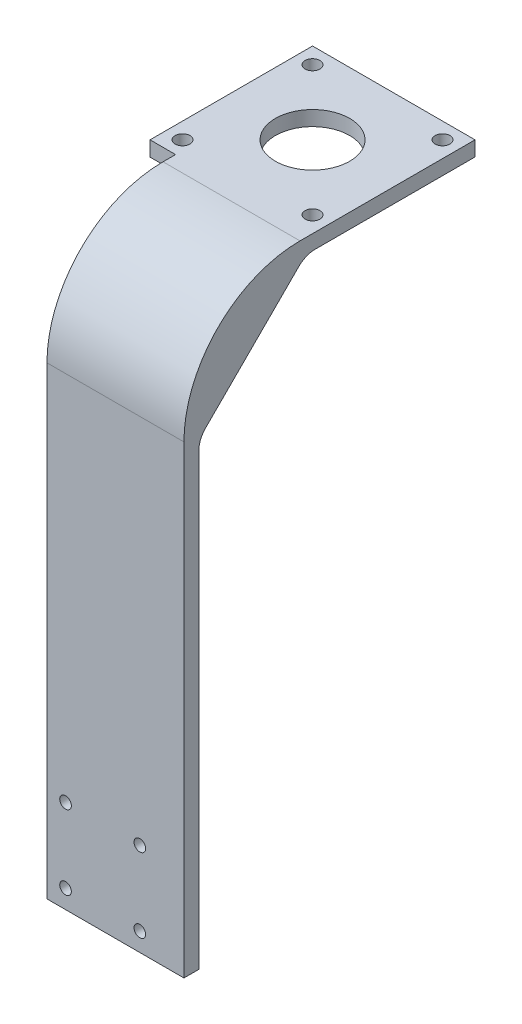
ISO-10303-21;
HEADER;
FILE_DESCRIPTION(('STEP AP214'),'2;1');
FILE_NAME('part.step','',(''),(''),'','','');
FILE_SCHEMA(('AUTOMOTIVE_DESIGN { 1 0 10303 214 1 1 1 1 }'));
ENDSEC;
DATA;
#1=APPLICATION_CONTEXT('core data for automotive mechanical design processes');
#2=APPLICATION_PROTOCOL_DEFINITION('international standard','automotive_design',2000,#1);
#3=PRODUCT_CONTEXT('',#1,'mechanical');
#4=PRODUCT('Part','Part','',(#3));
#5=PRODUCT_RELATED_PRODUCT_CATEGORY('part','',(#4));
#6=PRODUCT_DEFINITION_FORMATION('','',#4);
#7=PRODUCT_DEFINITION_CONTEXT('part definition',#1,'design');
#8=PRODUCT_DEFINITION('design','',#6,#7);
#9=PRODUCT_DEFINITION_SHAPE('','',#8);
#10=(LENGTH_UNIT() NAMED_UNIT(*) SI_UNIT(.MILLI.,.METRE.));
#11=(NAMED_UNIT(*) PLANE_ANGLE_UNIT() SI_UNIT($,.RADIAN.));
#12=(NAMED_UNIT(*) SI_UNIT($,.STERADIAN.) SOLID_ANGLE_UNIT());
#13=UNCERTAINTY_MEASURE_WITH_UNIT(LENGTH_MEASURE(1.E-05),#10,'distance_accuracy_value','');
#14=(GEOMETRIC_REPRESENTATION_CONTEXT(3) GLOBAL_UNCERTAINTY_ASSIGNED_CONTEXT((#13)) GLOBAL_UNIT_ASSIGNED_CONTEXT((#10,
#11,#12)) REPRESENTATION_CONTEXT('',''));
#15=CARTESIAN_POINT('',(0.,0.,0.));
#16=DIRECTION('',(0.,0.,1.));
#17=DIRECTION('',(1.,0.,0.));
#18=AXIS2_PLACEMENT_3D('',#15,#16,#17);
#19=CARTESIAN_POINT('',(0.,0.,3.2));
#20=DIRECTION('',(0.,0.,-1.));
#21=DIRECTION('',(-1.,0.,0.));
#22=AXIS2_PLACEMENT_3D('',#19,#20,#21);
#23=PLANE('',#22);
#24=DIRECTION('',(1.,0.,0.));
#25=VECTOR('',#24,1.);
#26=CARTESIAN_POINT('',(-12.,-12.,3.2));
#27=LINE('',#26,#25);
#28=CARTESIAN_POINT('',(-12.,-12.,3.2));
#29=VERTEX_POINT('',#28);
#30=CARTESIAN_POINT('',(17.5,-12.,3.2));
#31=VERTEX_POINT('',#30);
#32=EDGE_CURVE('E244',#29,#31,#27,.T.);
#33=ORIENTED_EDGE('',*,*,#32,.T.);
#34=DIRECTION('',(0.,-1.,0.));
#35=VECTOR('',#34,1.);
#36=CARTESIAN_POINT('',(17.5,88.,3.2));
#37=LINE('',#36,#35);
#38=CARTESIAN_POINT('',(17.5,88.,3.19999999999999));
#39=VERTEX_POINT('',#38);
#40=EDGE_CURVE('E161',#39,#31,#37,.T.);
#41=ORIENTED_EDGE('',*,*,#40,.F.);
#42=DIRECTION('',(-1.,0.,0.));
#43=VECTOR('',#42,1.);
#44=CARTESIAN_POINT('',(0.,88.,3.2));
#45=LINE('',#44,#43);
#46=CARTESIAN_POINT('',(-12.,88.,3.2));
#47=VERTEX_POINT('',#46);
#48=EDGE_CURVE('E255',#39,#47,#45,.T.);
#49=ORIENTED_EDGE('',*,*,#48,.T.);
#50=DIRECTION('',(0.,-1.,0.));
#51=VECTOR('',#50,1.);
#52=CARTESIAN_POINT('',(-12.,-12.,3.2));
#53=LINE('',#52,#51);
#54=EDGE_CURVE('E242',#47,#29,#53,.T.);
#55=ORIENTED_EDGE('',*,*,#54,.T.);
#56=EDGE_LOOP('',(#33,#41,#49,#55));
#57=FACE_BOUND('',#56,.T.);
#58=CARTESIAN_POINT('',(-8.,8.,3.2));
#59=DIRECTION('',(0.,0.,1.));
#60=DIRECTION('',(1.,0.,0.));
#61=AXIS2_PLACEMENT_3D('',#58,#59,#60);
#62=CIRCLE('',#61,1.25);
#63=CARTESIAN_POINT('',(-6.75,8.,3.2));
#64=VERTEX_POINT('',#63);
#65=EDGE_CURVE('E236',#64,#64,#62,.T.);
#66=ORIENTED_EDGE('',*,*,#65,.F.);
#67=EDGE_LOOP('',(#66));
#68=FACE_BOUND('',#67,.T.);
#69=CARTESIAN_POINT('',(8.,8.,3.2));
#70=DIRECTION('',(0.,0.,1.));
#71=DIRECTION('',(1.,0.,0.));
#72=AXIS2_PLACEMENT_3D('',#69,#70,#71);
#73=CIRCLE('',#72,1.25);
#74=CARTESIAN_POINT('',(9.25,8.,3.2));
#75=VERTEX_POINT('',#74);
#76=EDGE_CURVE('E230',#75,#75,#73,.T.);
#77=ORIENTED_EDGE('',*,*,#76,.F.);
#78=EDGE_LOOP('',(#77));
#79=FACE_BOUND('',#78,.T.);
#80=CARTESIAN_POINT('',(8.,-8.,3.2));
#81=DIRECTION('',(0.,0.,1.));
#82=DIRECTION('',(1.,0.,0.));
#83=AXIS2_PLACEMENT_3D('',#80,#81,#82);
#84=CIRCLE('',#83,1.25);
#85=CARTESIAN_POINT('',(9.25,-8.,3.2));
#86=VERTEX_POINT('',#85);
#87=EDGE_CURVE('E224',#86,#86,#84,.T.);
#88=ORIENTED_EDGE('',*,*,#87,.F.);
#89=EDGE_LOOP('',(#88));
#90=FACE_BOUND('',#89,.T.);
#91=CARTESIAN_POINT('',(-8.,-8.,3.2));
#92=DIRECTION('',(0.,0.,1.));
#93=DIRECTION('',(1.,0.,0.));
#94=AXIS2_PLACEMENT_3D('',#91,#92,#93);
#95=CIRCLE('',#94,1.25);
#96=CARTESIAN_POINT('',(-6.75,-8.,3.2));
#97=VERTEX_POINT('',#96);
#98=EDGE_CURVE('E218',#97,#97,#95,.T.);
#99=ORIENTED_EDGE('',*,*,#98,.F.);
#100=EDGE_LOOP('',(#99));
#101=FACE_BOUND('',#100,.T.);
#102=ADVANCED_FACE('F35',(#57,#68,#79,#90,#101),#23,.F.);
#103=CARTESIAN_POINT('',(0.,0.,0.));
#104=DIRECTION('',(0.,0.,-1.));
#105=DIRECTION('',(-1.,0.,0.));
#106=AXIS2_PLACEMENT_3D('',#103,#104,#105);
#107=PLANE('',#106);
#108=DIRECTION('',(0.,-1.,0.));
#109=VECTOR('',#108,1.);
#110=CARTESIAN_POINT('',(-12.,-12.,0.));
#111=LINE('',#110,#109);
#112=CARTESIAN_POINT('',(-12.,84.7289321881346,0.));
#113=VERTEX_POINT('',#112);
#114=CARTESIAN_POINT('',(-12.,-12.,0.));
#115=VERTEX_POINT('',#114);
#116=EDGE_CURVE('E239',#113,#115,#111,.T.);
#117=ORIENTED_EDGE('',*,*,#116,.F.);
#118=DIRECTION('',(1.,0.,0.));
#119=VECTOR('',#118,1.);
#120=CARTESIAN_POINT('',(0.,84.7289321881346,0.));
#121=LINE('',#120,#119);
#122=CARTESIAN_POINT('',(17.5,84.7289321881346,0.));
#123=VERTEX_POINT('',#122);
#124=EDGE_CURVE('E142',#113,#123,#121,.T.);
#125=ORIENTED_EDGE('',*,*,#124,.T.);
#126=DIRECTION('',(0.,1.,0.));
#127=VECTOR('',#126,1.);
#128=CARTESIAN_POINT('',(17.5,-12.,0.));
#129=LINE('',#128,#127);
#130=CARTESIAN_POINT('',(17.5,-12.,0.));
#131=VERTEX_POINT('',#130);
#132=EDGE_CURVE('E154',#131,#123,#129,.T.);
#133=ORIENTED_EDGE('',*,*,#132,.F.);
#134=DIRECTION('',(1.,0.,0.));
#135=VECTOR('',#134,1.);
#136=CARTESIAN_POINT('',(-12.,-12.,0.));
#137=LINE('',#136,#135);
#138=EDGE_CURVE('E245',#115,#131,#137,.T.);
#139=ORIENTED_EDGE('',*,*,#138,.F.);
#140=EDGE_LOOP('',(#117,#125,#133,#139));
#141=FACE_BOUND('',#140,.T.);
#142=CARTESIAN_POINT('',(8.,-8.,0.));
#143=DIRECTION('',(0.,0.,1.));
#144=DIRECTION('',(1.,0.,0.));
#145=AXIS2_PLACEMENT_3D('',#142,#143,#144);
#146=CIRCLE('',#145,1.25);
#147=CARTESIAN_POINT('',(9.25,-8.,0.));
#148=VERTEX_POINT('',#147);
#149=EDGE_CURVE('E221',#148,#148,#146,.T.);
#150=ORIENTED_EDGE('',*,*,#149,.T.);
#151=EDGE_LOOP('',(#150));
#152=FACE_BOUND('',#151,.T.);
#153=CARTESIAN_POINT('',(-8.,8.,0.));
#154=DIRECTION('',(0.,0.,1.));
#155=DIRECTION('',(1.,0.,0.));
#156=AXIS2_PLACEMENT_3D('',#153,#154,#155);
#157=CIRCLE('',#156,1.25);
#158=CARTESIAN_POINT('',(-6.75,8.,0.));
#159=VERTEX_POINT('',#158);
#160=EDGE_CURVE('E233',#159,#159,#157,.T.);
#161=ORIENTED_EDGE('',*,*,#160,.T.);
#162=EDGE_LOOP('',(#161));
#163=FACE_BOUND('',#162,.T.);
#164=CARTESIAN_POINT('',(8.,8.,0.));
#165=DIRECTION('',(0.,0.,1.));
#166=DIRECTION('',(1.,0.,0.));
#167=AXIS2_PLACEMENT_3D('',#164,#165,#166);
#168=CIRCLE('',#167,1.25);
#169=CARTESIAN_POINT('',(9.25,8.,0.));
#170=VERTEX_POINT('',#169);
#171=EDGE_CURVE('E227',#170,#170,#168,.T.);
#172=ORIENTED_EDGE('',*,*,#171,.T.);
#173=EDGE_LOOP('',(#172));
#174=FACE_BOUND('',#173,.T.);
#175=CARTESIAN_POINT('',(-8.,-8.,0.));
#176=DIRECTION('',(0.,0.,1.));
#177=DIRECTION('',(1.,0.,0.));
#178=AXIS2_PLACEMENT_3D('',#175,#176,#177);
#179=CIRCLE('',#178,1.25);
#180=CARTESIAN_POINT('',(-6.75,-8.,0.));
#181=VERTEX_POINT('',#180);
#182=EDGE_CURVE('E217',#181,#181,#179,.T.);
#183=ORIENTED_EDGE('',*,*,#182,.T.);
#184=EDGE_LOOP('',(#183));
#185=FACE_BOUND('',#184,.T.);
#186=ADVANCED_FACE('F308',(#141,#152,#163,#174,#185),#107,.T.);
#187=CARTESIAN_POINT('',(-12.,-12.,3.2));
#188=DIRECTION('',(1.,0.,0.));
#189=DIRECTION('',(0.,0.,-1.));
#190=AXIS2_PLACEMENT_3D('',#187,#188,#189);
#191=PLANE('',#190);
#192=ORIENTED_EDGE('',*,*,#54,.F.);
#193=CARTESIAN_POINT('',(-12.,88.,-21.8));
#194=DIRECTION('',(1.,0.,0.));
#195=DIRECTION('',(0.,0.,-1.));
#196=AXIS2_PLACEMENT_3D('',#193,#194,#195);
#197=CIRCLE('',#196,25.);
#198=CARTESIAN_POINT('',(-12.,113.,-21.8));
#199=VERTEX_POINT('',#198);
#200=EDGE_CURVE('E258',#47,#199,#197,.F.);
#201=ORIENTED_EDGE('',*,*,#200,.T.);
#202=DIRECTION('',(0.,0.,-1.));
#203=VECTOR('',#202,1.);
#204=CARTESIAN_POINT('',(-12.,113.,3.2));
#205=LINE('',#204,#203);
#206=CARTESIAN_POINT('',(-12.,113.,-24.5));
#207=VERTEX_POINT('',#206);
#208=EDGE_CURVE('E247',#199,#207,#205,.T.);
#209=ORIENTED_EDGE('',*,*,#208,.T.);
#210=DIRECTION('',(0.,-1.,0.));
#211=VECTOR('',#210,1.);
#212=CARTESIAN_POINT('',(-12.,-12.,-24.5));
#213=LINE('',#212,#211);
#214=CARTESIAN_POINT('',(-12.,109.767281102802,-24.5));
#215=VERTEX_POINT('',#214);
#216=EDGE_CURVE('E50',#207,#215,#213,.T.);
#217=ORIENTED_EDGE('',*,*,#216,.T.);
#218=CARTESIAN_POINT('',(-12.,104.8,-25.0710678118656));
#219=DIRECTION('',(1.,0.,0.));
#220=DIRECTION('',(0.,0.,-1.));
#221=AXIS2_PLACEMENT_3D('',#218,#219,#220);
#222=CIRCLE('',#221,5.);
#223=CARTESIAN_POINT('',(-12.,108.335533905933,-21.5355339059329));
#224=VERTEX_POINT('',#223);
#225=EDGE_CURVE('E133',#215,#224,#222,.T.);
#226=ORIENTED_EDGE('',*,*,#225,.T.);
#227=DIRECTION('',(0.,-0.707106781186544,0.707106781186551));
#228=VECTOR('',#227,1.);
#229=CARTESIAN_POINT('',(-12.,35.8000000000006,51.0000000000001));
#230=LINE('',#229,#228);
#231=CARTESIAN_POINT('',(-12.,88.2644660940674,-1.46446609406729));
#232=VERTEX_POINT('',#231);
#233=EDGE_CURVE('E141',#224,#232,#230,.T.);
#234=ORIENTED_EDGE('',*,*,#233,.T.);
#235=CARTESIAN_POINT('',(-12.,84.7289321881346,-5.));
#236=DIRECTION('',(1.,0.,0.));
#237=DIRECTION('',(0.,0.,-1.));
#238=AXIS2_PLACEMENT_3D('',#235,#236,#237);
#239=CIRCLE('',#238,5.);
#240=EDGE_CURVE('E11',#232,#113,#239,.T.);
#241=ORIENTED_EDGE('',*,*,#240,.T.);
#242=ORIENTED_EDGE('',*,*,#116,.T.);
#243=DIRECTION('',(0.,0.,-1.));
#244=VECTOR('',#243,1.);
#245=CARTESIAN_POINT('',(-12.,-12.,3.2));
#246=LINE('',#245,#244);
#247=EDGE_CURVE('E251',#29,#115,#246,.T.);
#248=ORIENTED_EDGE('',*,*,#247,.F.);
#249=EDGE_LOOP('',(#192,#201,#209,#217,#226,#234,#241,#242,#248));
#250=FACE_BOUND('',#249,.T.);
#251=ADVANCED_FACE('F271',(#250),#191,.F.);
#252=CARTESIAN_POINT('',(-12.,-12.,3.2));
#253=DIRECTION('',(0.,1.,0.));
#254=DIRECTION('',(0.,0.,1.));
#255=AXIS2_PLACEMENT_3D('',#252,#253,#254);
#256=PLANE('',#255);
#257=ORIENTED_EDGE('',*,*,#138,.T.);
#258=DIRECTION('',(0.,0.,-1.));
#259=VECTOR('',#258,1.);
#260=CARTESIAN_POINT('',(17.5,-12.,3.20000000000001));
#261=LINE('',#260,#259);
#262=EDGE_CURVE('E158',#31,#131,#261,.T.);
#263=ORIENTED_EDGE('',*,*,#262,.F.);
#264=ORIENTED_EDGE('',*,*,#32,.F.);
#265=ORIENTED_EDGE('',*,*,#247,.T.);
#266=EDGE_LOOP('',(#257,#263,#264,#265));
#267=FACE_BOUND('',#266,.T.);
#268=ADVANCED_FACE('F303',(#267),#256,.F.);
#269=CARTESIAN_POINT('',(-12.,113.,3.2));
#270=DIRECTION('',(0.,-1.,0.));
#271=DIRECTION('',(0.,0.,-1.));
#272=AXIS2_PLACEMENT_3D('',#269,#270,#271);
#273=PLANE('',#272);
#274=CARTESIAN_POINT('',(0.,113.,-42.));
#275=DIRECTION('',(0.,-1.,0.));
#276=DIRECTION('',(0.,0.,-1.));
#277=AXIS2_PLACEMENT_3D('',#274,#275,#276);
#278=CIRCLE('',#277,8.);
#279=CARTESIAN_POINT('',(0.,113.,-50.));
#280=VERTEX_POINT('',#279);
#281=EDGE_CURVE('E152',#280,#280,#278,.F.);
#282=ORIENTED_EDGE('',*,*,#281,.F.);
#283=EDGE_LOOP('',(#282));
#284=FACE_BOUND('',#283,.T.);
#285=ORIENTED_EDGE('',*,*,#208,.F.);
#286=DIRECTION('',(-1.,0.,0.));
#287=VECTOR('',#286,1.);
#288=CARTESIAN_POINT('',(-12.,113.,-21.8));
#289=LINE('',#288,#287);
#290=CARTESIAN_POINT('',(17.5,113.,-21.8));
#291=VERTEX_POINT('',#290);
#292=EDGE_CURVE('E260',#199,#291,#289,.F.);
#293=ORIENTED_EDGE('',*,*,#292,.T.);
#294=DIRECTION('',(0.,0.,-1.));
#295=VECTOR('',#294,1.);
#296=CARTESIAN_POINT('',(17.5,113.,-59.5));
#297=LINE('',#296,#295);
#298=CARTESIAN_POINT('',(17.5,113.,-59.5));
#299=VERTEX_POINT('',#298);
#300=EDGE_CURVE('E204',#291,#299,#297,.T.);
#301=ORIENTED_EDGE('',*,*,#300,.T.);
#302=DIRECTION('',(-1.,0.,0.));
#303=VECTOR('',#302,1.);
#304=CARTESIAN_POINT('',(17.5,113.,-59.5));
#305=LINE('',#304,#303);
#306=CARTESIAN_POINT('',(-17.5,113.,-59.5));
#307=VERTEX_POINT('',#306);
#308=EDGE_CURVE('E207',#299,#307,#305,.T.);
#309=ORIENTED_EDGE('',*,*,#308,.T.);
#310=DIRECTION('',(0.,0.,1.));
#311=VECTOR('',#310,1.);
#312=CARTESIAN_POINT('',(-17.5,113.,-59.5));
#313=LINE('',#312,#311);
#314=CARTESIAN_POINT('',(-17.5,113.,-24.5));
#315=VERTEX_POINT('',#314);
#316=EDGE_CURVE('E198',#307,#315,#313,.T.);
#317=ORIENTED_EDGE('',*,*,#316,.T.);
#318=DIRECTION('',(1.,0.,0.));
#319=VECTOR('',#318,1.);
#320=CARTESIAN_POINT('',(17.5,113.,-24.5));
#321=LINE('',#320,#319);
#322=EDGE_CURVE('E201',#315,#207,#321,.T.);
#323=ORIENTED_EDGE('',*,*,#322,.T.);
#324=EDGE_LOOP('',(#285,#293,#301,#309,#317,#323));
#325=FACE_BOUND('',#324,.T.);
#326=CARTESIAN_POINT('',(-14.,113.,-28.));
#327=DIRECTION('',(0.,1.,0.));
#328=DIRECTION('',(0.,0.,1.));
#329=AXIS2_PLACEMENT_3D('',#326,#327,#328);
#330=CIRCLE('',#329,1.6);
#331=CARTESIAN_POINT('',(-14.,113.,-26.4));
#332=VERTEX_POINT('',#331);
#333=EDGE_CURVE('E169',#332,#332,#330,.T.);
#334=ORIENTED_EDGE('',*,*,#333,.F.);
#335=EDGE_LOOP('',(#334));
#336=FACE_BOUND('',#335,.T.);
#337=CARTESIAN_POINT('',(-14.,113.,-56.));
#338=DIRECTION('',(0.,1.,0.));
#339=DIRECTION('',(0.,0.,1.));
#340=AXIS2_PLACEMENT_3D('',#337,#338,#339);
#341=CIRCLE('',#340,1.6);
#342=CARTESIAN_POINT('',(-14.,113.,-54.4));
#343=VERTEX_POINT('',#342);
#344=EDGE_CURVE('E189',#343,#343,#341,.T.);
#345=ORIENTED_EDGE('',*,*,#344,.F.);
#346=EDGE_LOOP('',(#345));
#347=FACE_BOUND('',#346,.T.);
#348=CARTESIAN_POINT('',(14.,113.,-56.));
#349=DIRECTION('',(0.,1.,0.));
#350=DIRECTION('',(0.,0.,1.));
#351=AXIS2_PLACEMENT_3D('',#348,#349,#350);
#352=CIRCLE('',#351,1.6);
#353=CARTESIAN_POINT('',(14.,113.,-54.4));
#354=VERTEX_POINT('',#353);
#355=EDGE_CURVE('E192',#354,#354,#352,.T.);
#356=ORIENTED_EDGE('',*,*,#355,.F.);
#357=EDGE_LOOP('',(#356));
#358=FACE_BOUND('',#357,.T.);
#359=CARTESIAN_POINT('',(14.,113.,-28.));
#360=DIRECTION('',(0.,1.,0.));
#361=DIRECTION('',(0.,0.,1.));
#362=AXIS2_PLACEMENT_3D('',#359,#360,#361);
#363=CIRCLE('',#362,1.6);
#364=CARTESIAN_POINT('',(14.,113.,-26.4));
#365=VERTEX_POINT('',#364);
#366=EDGE_CURVE('E195',#365,#365,#363,.T.);
#367=ORIENTED_EDGE('',*,*,#366,.F.);
#368=EDGE_LOOP('',(#367));
#369=FACE_BOUND('',#368,.T.);
#370=ADVANCED_FACE('F277',(#284,#325,#336,#347,#358,#369),#273,.F.);
#371=CARTESIAN_POINT('',(-8.,8.,3.2));
#372=DIRECTION('',(0.,0.,-1.));
#373=DIRECTION('',(-1.,0.,0.));
#374=AXIS2_PLACEMENT_3D('',#371,#372,#373);
#375=CYLINDRICAL_SURFACE('',#374,1.25);
#376=ORIENTED_EDGE('',*,*,#65,.T.);
#377=EDGE_LOOP('',(#376));
#378=FACE_BOUND('',#377,.T.);
#379=ORIENTED_EDGE('',*,*,#160,.F.);
#380=EDGE_LOOP('',(#379));
#381=FACE_BOUND('',#380,.T.);
#382=ADVANCED_FACE('F323',(#378,#381),#375,.F.);
#383=CARTESIAN_POINT('',(8.,8.,3.2));
#384=DIRECTION('',(0.,0.,-1.));
#385=DIRECTION('',(-1.,0.,0.));
#386=AXIS2_PLACEMENT_3D('',#383,#384,#385);
#387=CYLINDRICAL_SURFACE('',#386,1.25);
#388=ORIENTED_EDGE('',*,*,#76,.T.);
#389=EDGE_LOOP('',(#388));
#390=FACE_BOUND('',#389,.T.);
#391=ORIENTED_EDGE('',*,*,#171,.F.);
#392=EDGE_LOOP('',(#391));
#393=FACE_BOUND('',#392,.T.);
#394=ADVANCED_FACE('F500',(#390,#393),#387,.F.);
#395=CARTESIAN_POINT('',(8.,-8.,3.2));
#396=DIRECTION('',(0.,0.,-1.));
#397=DIRECTION('',(-1.,0.,0.));
#398=AXIS2_PLACEMENT_3D('',#395,#396,#397);
#399=CYLINDRICAL_SURFACE('',#398,1.25);
#400=ORIENTED_EDGE('',*,*,#87,.T.);
#401=EDGE_LOOP('',(#400));
#402=FACE_BOUND('',#401,.T.);
#403=ORIENTED_EDGE('',*,*,#149,.F.);
#404=EDGE_LOOP('',(#403));
#405=FACE_BOUND('',#404,.T.);
#406=ADVANCED_FACE('F488',(#402,#405),#399,.F.);
#407=CARTESIAN_POINT('',(-8.,-8.,3.2));
#408=DIRECTION('',(0.,0.,-1.));
#409=DIRECTION('',(-1.,0.,0.));
#410=AXIS2_PLACEMENT_3D('',#407,#408,#409);
#411=CYLINDRICAL_SURFACE('',#410,1.25);
#412=ORIENTED_EDGE('',*,*,#98,.T.);
#413=EDGE_LOOP('',(#412));
#414=FACE_BOUND('',#413,.T.);
#415=ORIENTED_EDGE('',*,*,#182,.F.);
#416=EDGE_LOOP('',(#415));
#417=FACE_BOUND('',#416,.T.);
#418=ADVANCED_FACE('F483',(#414,#417),#411,.F.);
#419=CARTESIAN_POINT('',(12.,109.8,-42.));
#420=DIRECTION('',(0.,1.,0.));
#421=DIRECTION('',(0.,0.,1.));
#422=AXIS2_PLACEMENT_3D('',#419,#420,#421);
#423=PLANE('',#422);
#424=CARTESIAN_POINT('',(0.,109.8,-42.));
#425=DIRECTION('',(0.,-1.,0.));
#426=DIRECTION('',(0.,0.,-1.));
#427=AXIS2_PLACEMENT_3D('',#424,#425,#426);
#428=CIRCLE('',#427,8.);
#429=CARTESIAN_POINT('',(0.,109.8,-50.));
#430=VERTEX_POINT('',#429);
#431=EDGE_CURVE('E149',#430,#430,#428,.T.);
#432=ORIENTED_EDGE('',*,*,#431,.F.);
#433=EDGE_LOOP('',(#432));
#434=FACE_BOUND('',#433,.T.);
#435=DIRECTION('',(0.,0.,1.));
#436=VECTOR('',#435,1.);
#437=CARTESIAN_POINT('',(17.5,109.8,-59.5));
#438=LINE('',#437,#436);
#439=CARTESIAN_POINT('',(17.5,109.8,-59.5));
#440=VERTEX_POINT('',#439);
#441=CARTESIAN_POINT('',(17.5,109.8,-25.0710678118656));
#442=VERTEX_POINT('',#441);
#443=EDGE_CURVE('E181',#440,#442,#438,.T.);
#444=ORIENTED_EDGE('',*,*,#443,.T.);
#445=DIRECTION('',(-1.,0.,0.));
#446=VECTOR('',#445,1.);
#447=CARTESIAN_POINT('',(-12.,109.8,-25.0710678118656));
#448=LINE('',#447,#446);
#449=CARTESIAN_POINT('',(-17.5,109.8,-25.0710678118656));
#450=VERTEX_POINT('',#449);
#451=EDGE_CURVE('E128',#442,#450,#448,.T.);
#452=ORIENTED_EDGE('',*,*,#451,.T.);
#453=DIRECTION('',(0.,0.,-1.));
#454=VECTOR('',#453,1.);
#455=CARTESIAN_POINT('',(-17.5,109.8,-59.5));
#456=LINE('',#455,#454);
#457=CARTESIAN_POINT('',(-17.5,109.8,-59.5));
#458=VERTEX_POINT('',#457);
#459=EDGE_CURVE('E178',#450,#458,#456,.T.);
#460=ORIENTED_EDGE('',*,*,#459,.T.);
#461=DIRECTION('',(1.,0.,0.));
#462=VECTOR('',#461,1.);
#463=CARTESIAN_POINT('',(17.5,109.8,-59.5));
#464=LINE('',#463,#462);
#465=EDGE_CURVE('E183',#458,#440,#464,.T.);
#466=ORIENTED_EDGE('',*,*,#465,.T.);
#467=EDGE_LOOP('',(#444,#452,#460,#466));
#468=FACE_BOUND('',#467,.T.);
#469=CARTESIAN_POINT('',(14.,109.8,-56.));
#470=DIRECTION('',(0.,1.,0.));
#471=DIRECTION('',(0.,0.,1.));
#472=AXIS2_PLACEMENT_3D('',#469,#470,#471);
#473=CIRCLE('',#472,1.6);
#474=CARTESIAN_POINT('',(14.,109.8,-54.4));
#475=VERTEX_POINT('',#474);
#476=EDGE_CURVE('E175',#475,#475,#473,.F.);
#477=ORIENTED_EDGE('',*,*,#476,.F.);
#478=EDGE_LOOP('',(#477));
#479=FACE_BOUND('',#478,.T.);
#480=CARTESIAN_POINT('',(-14.,109.8,-28.));
#481=DIRECTION('',(0.,1.,0.));
#482=DIRECTION('',(0.,0.,1.));
#483=AXIS2_PLACEMENT_3D('',#480,#481,#482);
#484=CIRCLE('',#483,1.6);
#485=CARTESIAN_POINT('',(-14.,109.8,-26.4));
#486=VERTEX_POINT('',#485);
#487=EDGE_CURVE('E174',#486,#486,#484,.F.);
#488=ORIENTED_EDGE('',*,*,#487,.F.);
#489=EDGE_LOOP('',(#488));
#490=FACE_BOUND('',#489,.T.);
#491=CARTESIAN_POINT('',(-14.,109.8,-56.));
#492=DIRECTION('',(0.,1.,0.));
#493=DIRECTION('',(0.,0.,1.));
#494=AXIS2_PLACEMENT_3D('',#491,#492,#493);
#495=CIRCLE('',#494,1.6);
#496=CARTESIAN_POINT('',(-14.,109.8,-54.4));
#497=VERTEX_POINT('',#496);
#498=EDGE_CURVE('E170',#497,#497,#495,.F.);
#499=ORIENTED_EDGE('',*,*,#498,.F.);
#500=EDGE_LOOP('',(#499));
#501=FACE_BOUND('',#500,.T.);
#502=CARTESIAN_POINT('',(14.,109.8,-28.));
#503=DIRECTION('',(0.,1.,0.));
#504=DIRECTION('',(0.,0.,1.));
#505=AXIS2_PLACEMENT_3D('',#502,#503,#504);
#506=CIRCLE('',#505,1.6);
#507=CARTESIAN_POINT('',(14.,109.8,-26.4));
#508=VERTEX_POINT('',#507);
#509=EDGE_CURVE('E173',#508,#508,#506,.F.);
#510=ORIENTED_EDGE('',*,*,#509,.F.);
#511=EDGE_LOOP('',(#510));
#512=FACE_BOUND('',#511,.T.);
#513=ADVANCED_FACE('F288',(#434,#468,#479,#490,#501,#512),#423,.F.);
#514=CARTESIAN_POINT('',(17.5,60.3025253169417,-24.5));
#515=DIRECTION('',(0.,0.,1.));
#516=DIRECTION('',(1.,0.,0.));
#517=AXIS2_PLACEMENT_3D('',#514,#515,#516);
#518=PLANE('',#517);
#519=ORIENTED_EDGE('',*,*,#216,.F.);
#520=ORIENTED_EDGE('',*,*,#322,.F.);
#521=DIRECTION('',(0.,1.,0.));
#522=VECTOR('',#521,1.);
#523=CARTESIAN_POINT('',(-17.5,60.3025253169417,-24.5));
#524=LINE('',#523,#522);
#525=CARTESIAN_POINT('',(-17.5,109.767281102802,-24.5));
#526=VERTEX_POINT('',#525);
#527=EDGE_CURVE('E57',#526,#315,#524,.T.);
#528=ORIENTED_EDGE('',*,*,#527,.F.);
#529=DIRECTION('',(1.,0.,0.));
#530=VECTOR('',#529,1.);
#531=CARTESIAN_POINT('',(-17.5,109.767281102802,-24.5));
#532=LINE('',#531,#530);
#533=EDGE_CURVE('E268',#526,#215,#532,.T.);
#534=ORIENTED_EDGE('',*,*,#533,.T.);
#535=EDGE_LOOP('',(#519,#520,#528,#534));
#536=FACE_BOUND('',#535,.T.);
#537=ADVANCED_FACE('F274',(#536),#518,.T.);
#538=CARTESIAN_POINT('',(17.5,60.3025253169417,-59.5));
#539=DIRECTION('',(1.,0.,0.));
#540=DIRECTION('',(0.,0.,-1.));
#541=AXIS2_PLACEMENT_3D('',#538,#539,#540);
#542=PLANE('',#541);
#543=ORIENTED_EDGE('',*,*,#443,.F.);
#544=DIRECTION('',(0.,1.,0.));
#545=VECTOR('',#544,1.);
#546=CARTESIAN_POINT('',(17.5,60.3025253169417,-59.5));
#547=LINE('',#546,#545);
#548=EDGE_CURVE('E211',#440,#299,#547,.T.);
#549=ORIENTED_EDGE('',*,*,#548,.T.);
#550=ORIENTED_EDGE('',*,*,#300,.F.);
#551=CARTESIAN_POINT('',(17.5,88.,-21.8));
#552=DIRECTION('',(1.,0.,0.));
#553=DIRECTION('',(0.,0.,-1.));
#554=AXIS2_PLACEMENT_3D('',#551,#552,#553);
#555=CIRCLE('',#554,25.);
#556=EDGE_CURVE('E164',#291,#39,#555,.T.);
#557=ORIENTED_EDGE('',*,*,#556,.T.);
#558=ORIENTED_EDGE('',*,*,#40,.T.);
#559=ORIENTED_EDGE('',*,*,#262,.T.);
#560=ORIENTED_EDGE('',*,*,#132,.T.);
#561=CARTESIAN_POINT('',(17.5,84.7289321881346,-5.));
#562=DIRECTION('',(1.,0.,0.));
#563=DIRECTION('',(0.,0.,-1.));
#564=AXIS2_PLACEMENT_3D('',#561,#562,#563);
#565=CIRCLE('',#564,5.);
#566=CARTESIAN_POINT('',(17.5,88.2644660940674,-1.46446609406728));
#567=VERTEX_POINT('',#566);
#568=EDGE_CURVE('E148',#123,#567,#565,.F.);
#569=ORIENTED_EDGE('',*,*,#568,.T.);
#570=DIRECTION('',(0.,0.707106781186544,-0.707106781186551));
#571=VECTOR('',#570,1.);
#572=CARTESIAN_POINT('',(17.5,88.2644660940674,-1.46446609406728));
#573=LINE('',#572,#571);
#574=CARTESIAN_POINT('',(17.5,108.335533905933,-21.5355339059329));
#575=VERTEX_POINT('',#574);
#576=EDGE_CURVE('E138',#567,#575,#573,.T.);
#577=ORIENTED_EDGE('',*,*,#576,.T.);
#578=CARTESIAN_POINT('',(17.5,104.8,-25.0710678118656));
#579=DIRECTION('',(1.,0.,0.));
#580=DIRECTION('',(0.,0.,-1.));
#581=AXIS2_PLACEMENT_3D('',#578,#579,#580);
#582=CIRCLE('',#581,5.);
#583=EDGE_CURVE('E43',#575,#442,#582,.F.);
#584=ORIENTED_EDGE('',*,*,#583,.T.);
#585=EDGE_LOOP('',(#543,#549,#550,#557,#558,#559,#560,#569,#577,#584));
#586=FACE_BOUND('',#585,.T.);
#587=ADVANCED_FACE('F145',(#586),#542,.T.);
#588=CARTESIAN_POINT('',(17.5,60.3025253169417,-59.5));
#589=DIRECTION('',(0.,0.,-1.));
#590=DIRECTION('',(-1.,0.,0.));
#591=AXIS2_PLACEMENT_3D('',#588,#589,#590);
#592=PLANE('',#591);
#593=ORIENTED_EDGE('',*,*,#465,.F.);
#594=DIRECTION('',(0.,1.,0.));
#595=VECTOR('',#594,1.);
#596=CARTESIAN_POINT('',(-17.5,60.3025253169417,-59.5));
#597=LINE('',#596,#595);
#598=EDGE_CURVE('E184',#458,#307,#597,.T.);
#599=ORIENTED_EDGE('',*,*,#598,.T.);
#600=ORIENTED_EDGE('',*,*,#308,.F.);
#601=ORIENTED_EDGE('',*,*,#548,.F.);
#602=EDGE_LOOP('',(#593,#599,#600,#601));
#603=FACE_BOUND('',#602,.T.);
#604=ADVANCED_FACE('F292',(#603),#592,.T.);
#605=CARTESIAN_POINT('',(-17.5,60.3025253169417,-59.5));
#606=DIRECTION('',(-1.,0.,0.));
#607=DIRECTION('',(0.,0.,1.));
#608=AXIS2_PLACEMENT_3D('',#605,#606,#607);
#609=PLANE('',#608);
#610=ORIENTED_EDGE('',*,*,#459,.F.);
#611=CARTESIAN_POINT('',(-17.5,104.8,-25.0710678118656));
#612=DIRECTION('',(-1.,0.,0.));
#613=DIRECTION('',(0.,0.,1.));
#614=AXIS2_PLACEMENT_3D('',#611,#612,#613);
#615=CIRCLE('',#614,5.);
#616=EDGE_CURVE('E266',#450,#526,#615,.F.);
#617=ORIENTED_EDGE('',*,*,#616,.T.);
#618=ORIENTED_EDGE('',*,*,#527,.T.);
#619=ORIENTED_EDGE('',*,*,#316,.F.);
#620=ORIENTED_EDGE('',*,*,#598,.F.);
#621=EDGE_LOOP('',(#610,#617,#618,#619,#620));
#622=FACE_BOUND('',#621,.T.);
#623=ADVANCED_FACE('F285',(#622),#609,.T.);
#624=CARTESIAN_POINT('',(14.,60.3025253169417,-28.));
#625=DIRECTION('',(0.,1.,0.));
#626=DIRECTION('',(0.,0.,1.));
#627=AXIS2_PLACEMENT_3D('',#624,#625,#626);
#628=CYLINDRICAL_SURFACE('',#627,1.6);
#629=ORIENTED_EDGE('',*,*,#509,.T.);
#630=EDGE_LOOP('',(#629));
#631=FACE_BOUND('',#630,.T.);
#632=ORIENTED_EDGE('',*,*,#366,.T.);
#633=EDGE_LOOP('',(#632));
#634=FACE_BOUND('',#633,.T.);
#635=ADVANCED_FACE('F457',(#631,#634),#628,.F.);
#636=CARTESIAN_POINT('',(14.,60.3025253169417,-56.));
#637=DIRECTION('',(0.,1.,0.));
#638=DIRECTION('',(0.,0.,1.));
#639=AXIS2_PLACEMENT_3D('',#636,#637,#638);
#640=CYLINDRICAL_SURFACE('',#639,1.6);
#641=ORIENTED_EDGE('',*,*,#476,.T.);
#642=EDGE_LOOP('',(#641));
#643=FACE_BOUND('',#642,.T.);
#644=ORIENTED_EDGE('',*,*,#355,.T.);
#645=EDGE_LOOP('',(#644));
#646=FACE_BOUND('',#645,.T.);
#647=ADVANCED_FACE('F448',(#643,#646),#640,.F.);
#648=CARTESIAN_POINT('',(-14.,60.3025253169417,-56.));
#649=DIRECTION('',(0.,1.,0.));
#650=DIRECTION('',(0.,0.,1.));
#651=AXIS2_PLACEMENT_3D('',#648,#649,#650);
#652=CYLINDRICAL_SURFACE('',#651,1.6);
#653=ORIENTED_EDGE('',*,*,#498,.T.);
#654=EDGE_LOOP('',(#653));
#655=FACE_BOUND('',#654,.T.);
#656=ORIENTED_EDGE('',*,*,#344,.T.);
#657=EDGE_LOOP('',(#656));
#658=FACE_BOUND('',#657,.T.);
#659=ADVANCED_FACE('F439',(#655,#658),#652,.F.);
#660=CARTESIAN_POINT('',(-14.,60.3025253169417,-28.));
#661=DIRECTION('',(0.,1.,0.));
#662=DIRECTION('',(0.,0.,1.));
#663=AXIS2_PLACEMENT_3D('',#660,#661,#662);
#664=CYLINDRICAL_SURFACE('',#663,1.6);
#665=ORIENTED_EDGE('',*,*,#487,.T.);
#666=EDGE_LOOP('',(#665));
#667=FACE_BOUND('',#666,.T.);
#668=ORIENTED_EDGE('',*,*,#333,.T.);
#669=EDGE_LOOP('',(#668));
#670=FACE_BOUND('',#669,.T.);
#671=ADVANCED_FACE('F429',(#667,#670),#664,.F.);
#672=CARTESIAN_POINT('',(0.,135.62741699797,-42.));
#673=DIRECTION('',(0.,-1.,0.));
#674=DIRECTION('',(0.,0.,-1.));
#675=AXIS2_PLACEMENT_3D('',#672,#673,#674);
#676=CYLINDRICAL_SURFACE('',#675,8.);
#677=ORIENTED_EDGE('',*,*,#281,.T.);
#678=EDGE_LOOP('',(#677));
#679=FACE_BOUND('',#678,.T.);
#680=ORIENTED_EDGE('',*,*,#431,.T.);
#681=EDGE_LOOP('',(#680));
#682=FACE_BOUND('',#681,.T.);
#683=ADVANCED_FACE('F338',(#679,#682),#676,.F.);
#684=CARTESIAN_POINT('',(12.,109.8,-23.0000000000002));
#685=DIRECTION('',(0.,0.707106781186551,0.707106781186544));
#686=DIRECTION('',(-1.,0.,0.));
#687=AXIS2_PLACEMENT_3D('',#684,#685,#686);
#688=PLANE('',#687);
#689=ORIENTED_EDGE('',*,*,#233,.F.);
#690=DIRECTION('',(-1.,0.,0.));
#691=VECTOR('',#690,1.);
#692=CARTESIAN_POINT('',(12.,108.335533905933,-21.5355339059329));
#693=LINE('',#692,#691);
#694=EDGE_CURVE('E126',#224,#575,#693,.F.);
#695=ORIENTED_EDGE('',*,*,#694,.T.);
#696=ORIENTED_EDGE('',*,*,#576,.F.);
#697=DIRECTION('',(1.,0.,0.));
#698=VECTOR('',#697,1.);
#699=CARTESIAN_POINT('',(12.,88.2644660940674,-1.46446609406728));
#700=LINE('',#699,#698);
#701=EDGE_CURVE('E143',#567,#232,#700,.F.);
#702=ORIENTED_EDGE('',*,*,#701,.T.);
#703=EDGE_LOOP('',(#689,#695,#696,#702));
#704=FACE_BOUND('',#703,.T.);
#705=ADVANCED_FACE('F137',(#704),#688,.F.);
#706=CARTESIAN_POINT('',(0.,88.,-21.8));
#707=DIRECTION('',(-1.,0.,0.));
#708=DIRECTION('',(0.,0.,1.));
#709=AXIS2_PLACEMENT_3D('',#706,#707,#708);
#710=CYLINDRICAL_SURFACE('',#709,25.);
#711=ORIENTED_EDGE('',*,*,#48,.F.);
#712=ORIENTED_EDGE('',*,*,#556,.F.);
#713=ORIENTED_EDGE('',*,*,#292,.F.);
#714=ORIENTED_EDGE('',*,*,#200,.F.);
#715=EDGE_LOOP('',(#711,#712,#713,#714));
#716=FACE_BOUND('',#715,.T.);
#717=ADVANCED_FACE('F295',(#716),#710,.T.);
#718=CARTESIAN_POINT('',(12.,104.8,-25.0710678118656));
#719=DIRECTION('',(1.,0.,0.));
#720=DIRECTION('',(0.,0.,-1.));
#721=AXIS2_PLACEMENT_3D('',#718,#719,#720);
#722=CYLINDRICAL_SURFACE('',#721,5.);
#723=ORIENTED_EDGE('',*,*,#583,.F.);
#724=ORIENTED_EDGE('',*,*,#694,.F.);
#725=ORIENTED_EDGE('',*,*,#225,.F.);
#726=ORIENTED_EDGE('',*,*,#533,.F.);
#727=ORIENTED_EDGE('',*,*,#616,.F.);
#728=ORIENTED_EDGE('',*,*,#451,.F.);
#729=EDGE_LOOP('',(#723,#724,#725,#726,#727,#728));
#730=FACE_BOUND('',#729,.T.);
#731=ADVANCED_FACE('F124',(#730),#722,.F.);
#732=CARTESIAN_POINT('',(0.,84.7289321881346,-5.));
#733=DIRECTION('',(1.,0.,0.));
#734=DIRECTION('',(0.,0.,-1.));
#735=AXIS2_PLACEMENT_3D('',#732,#733,#734);
#736=CYLINDRICAL_SURFACE('',#735,5.);
#737=ORIENTED_EDGE('',*,*,#240,.F.);
#738=ORIENTED_EDGE('',*,*,#701,.F.);
#739=ORIENTED_EDGE('',*,*,#568,.F.);
#740=ORIENTED_EDGE('',*,*,#124,.F.);
#741=EDGE_LOOP('',(#737,#738,#739,#740));
#742=FACE_BOUND('',#741,.T.);
#743=ADVANCED_FACE('F37',(#742),#736,.F.);
#744=CLOSED_SHELL('',(#102,#186,#251,#268,#370,#382,#394,#406,#418,#513,#537,#587,#604,#623,
#635,#647,#659,#671,#683,#705,#717,#731,#743));
#745=MANIFOLD_SOLID_BREP('B2',#744);
#746=ADVANCED_BREP_SHAPE_REPRESENTATION('',(#18,#745),#14);
#747=SHAPE_DEFINITION_REPRESENTATION(#9,#746);
ENDSEC;
END-ISO-10303-21;
